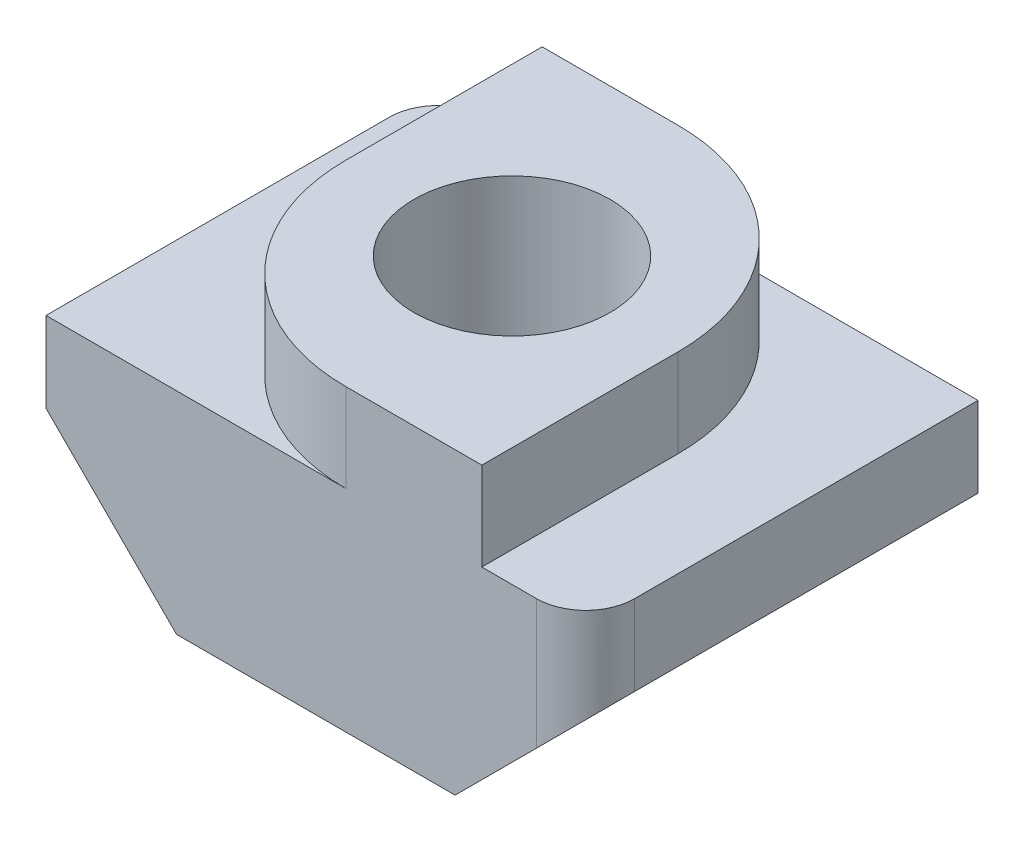
ISO-10303-21;
HEADER;
FILE_DESCRIPTION(('STEP AP214'),'2;1');
FILE_NAME('part.step','',(''),(''),'','','');
FILE_SCHEMA(('AUTOMOTIVE_DESIGN { 1 0 10303 214 1 1 1 1 }'));
ENDSEC;
DATA;
#1=APPLICATION_CONTEXT('core data for automotive mechanical design processes');
#2=APPLICATION_PROTOCOL_DEFINITION('international standard','automotive_design',2000,#1);
#3=PRODUCT_CONTEXT('',#1,'mechanical');
#4=PRODUCT('Part','Part','',(#3));
#5=PRODUCT_RELATED_PRODUCT_CATEGORY('part','',(#4));
#6=PRODUCT_DEFINITION_FORMATION('','',#4);
#7=PRODUCT_DEFINITION_CONTEXT('part definition',#1,'design');
#8=PRODUCT_DEFINITION('design','',#6,#7);
#9=PRODUCT_DEFINITION_SHAPE('','',#8);
#10=(LENGTH_UNIT() NAMED_UNIT(*) SI_UNIT(.MILLI.,.METRE.));
#11=(NAMED_UNIT(*) PLANE_ANGLE_UNIT() SI_UNIT($,.RADIAN.));
#12=(NAMED_UNIT(*) SI_UNIT($,.STERADIAN.) SOLID_ANGLE_UNIT());
#13=UNCERTAINTY_MEASURE_WITH_UNIT(LENGTH_MEASURE(1.E-05),#10,'distance_accuracy_value','');
#14=(GEOMETRIC_REPRESENTATION_CONTEXT(3) GLOBAL_UNCERTAINTY_ASSIGNED_CONTEXT((#13)) GLOBAL_UNIT_ASSIGNED_CONTEXT((#10,
#11,#12)) REPRESENTATION_CONTEXT('',''));
#15=CARTESIAN_POINT('',(0.,0.,0.));
#16=DIRECTION('',(0.,0.,1.));
#17=DIRECTION('',(1.,0.,0.));
#18=AXIS2_PLACEMENT_3D('',#15,#16,#17);
#19=CARTESIAN_POINT('',(0.,4.3,0.));
#20=DIRECTION('',(0.,-1.,0.));
#21=DIRECTION('',(0.,0.,-1.));
#22=AXIS2_PLACEMENT_3D('',#19,#20,#21);
#23=PLANE('',#22);
#24=DIRECTION('',(1.,0.,0.));
#25=VECTOR('',#24,1.);
#26=CARTESIAN_POINT('',(-5.5,4.3,4.));
#27=LINE('',#26,#25);
#28=CARTESIAN_POINT('',(3.385,4.3,4.));
#29=VERTEX_POINT('',#28);
#30=CARTESIAN_POINT('',(4.5,4.3,4.));
#31=VERTEX_POINT('',#30);
#32=EDGE_CURVE('E255',#29,#31,#27,.T.);
#33=ORIENTED_EDGE('',*,*,#32,.T.);
#34=CARTESIAN_POINT('',(4.5,4.3,3.));
#35=DIRECTION('',(0.,-1.,0.));
#36=DIRECTION('',(0.,0.,-1.));
#37=AXIS2_PLACEMENT_3D('',#34,#35,#36);
#38=CIRCLE('',#37,1.);
#39=CARTESIAN_POINT('',(5.5,4.3,3.));
#40=VERTEX_POINT('',#39);
#41=EDGE_CURVE('E203',#31,#40,#38,.F.);
#42=ORIENTED_EDGE('',*,*,#41,.T.);
#43=DIRECTION('',(0.,0.,-1.));
#44=VECTOR('',#43,1.);
#45=CARTESIAN_POINT('',(5.5,4.3,4.));
#46=LINE('',#45,#44);
#47=CARTESIAN_POINT('',(5.5,4.3,-4.));
#48=VERTEX_POINT('',#47);
#49=EDGE_CURVE('E233',#40,#48,#46,.T.);
#50=ORIENTED_EDGE('',*,*,#49,.T.);
#51=DIRECTION('',(-1.,0.,0.));
#52=VECTOR('',#51,1.);
#53=CARTESIAN_POINT('',(-5.5,4.3,-4.));
#54=LINE('',#53,#52);
#55=CARTESIAN_POINT('',(-0.615,4.3,-4.));
#56=VERTEX_POINT('',#55);
#57=EDGE_CURVE('E243',#48,#56,#54,.T.);
#58=ORIENTED_EDGE('',*,*,#57,.T.);
#59=CARTESIAN_POINT('',(-0.615,4.3,0.));
#60=DIRECTION('',(0.,-1.,0.));
#61=DIRECTION('',(0.,0.,-1.));
#62=AXIS2_PLACEMENT_3D('',#59,#60,#61);
#63=CIRCLE('',#62,4.);
#64=CARTESIAN_POINT('',(3.385,4.3,0.));
#65=VERTEX_POINT('',#64);
#66=EDGE_CURVE('E192',#56,#65,#63,.T.);
#67=ORIENTED_EDGE('',*,*,#66,.T.);
#68=DIRECTION('',(0.,0.,-1.));
#69=VECTOR('',#68,1.);
#70=CARTESIAN_POINT('',(3.385,4.3,4.));
#71=LINE('',#70,#69);
#72=EDGE_CURVE('E169',#29,#65,#71,.T.);
#73=ORIENTED_EDGE('',*,*,#72,.F.);
#74=EDGE_LOOP('',(#33,#42,#50,#58,#67,#73));
#75=FACE_BOUND('',#74,.T.);
#76=ADVANCED_FACE('F32',(#75),#23,.F.);
#77=CARTESIAN_POINT('',(-3.385,4.3,-4.));
#78=VERTEX_POINT('',#77);
#79=CARTESIAN_POINT('',(-4.5,4.3,-4.));
#80=VERTEX_POINT('',#79);
#81=EDGE_CURVE('E150',#78,#80,#54,.T.);
#82=ORIENTED_EDGE('',*,*,#81,.T.);
#83=CARTESIAN_POINT('',(-4.5,4.3,-3.));
#84=DIRECTION('',(0.,-1.,0.));
#85=DIRECTION('',(0.,0.,-1.));
#86=AXIS2_PLACEMENT_3D('',#83,#84,#85);
#87=CIRCLE('',#86,1.);
#88=CARTESIAN_POINT('',(-5.5,4.3,-3.));
#89=VERTEX_POINT('',#88);
#90=EDGE_CURVE('E11',#80,#89,#87,.F.);
#91=ORIENTED_EDGE('',*,*,#90,.T.);
#92=DIRECTION('',(0.,0.,1.));
#93=VECTOR('',#92,1.);
#94=CARTESIAN_POINT('',(-5.5,4.3,4.));
#95=LINE('',#94,#93);
#96=CARTESIAN_POINT('',(-5.5,4.3,4.));
#97=VERTEX_POINT('',#96);
#98=EDGE_CURVE('E215',#89,#97,#95,.T.);
#99=ORIENTED_EDGE('',*,*,#98,.T.);
#100=CARTESIAN_POINT('',(0.615,4.3,4.));
#101=VERTEX_POINT('',#100);
#102=EDGE_CURVE('E249',#97,#101,#27,.T.);
#103=ORIENTED_EDGE('',*,*,#102,.T.);
#104=CARTESIAN_POINT('',(0.615,4.3,0.));
#105=DIRECTION('',(0.,-1.,0.));
#106=DIRECTION('',(0.,0.,-1.));
#107=AXIS2_PLACEMENT_3D('',#104,#105,#106);
#108=CIRCLE('',#107,4.);
#109=CARTESIAN_POINT('',(-3.385,4.3,0.));
#110=VERTEX_POINT('',#109);
#111=EDGE_CURVE('E194',#101,#110,#108,.T.);
#112=ORIENTED_EDGE('',*,*,#111,.T.);
#113=DIRECTION('',(0.,0.,1.));
#114=VECTOR('',#113,1.);
#115=CARTESIAN_POINT('',(-3.385,4.3,4.));
#116=LINE('',#115,#114);
#117=EDGE_CURVE('E173',#78,#110,#116,.T.);
#118=ORIENTED_EDGE('',*,*,#117,.F.);
#119=EDGE_LOOP('',(#82,#91,#99,#103,#112,#118));
#120=FACE_BOUND('',#119,.T.);
#121=ADVANCED_FACE('F264',(#120),#23,.F.);
#122=CARTESIAN_POINT('',(0.,0.,0.));
#123=DIRECTION('',(0.,-1.,0.));
#124=DIRECTION('',(0.,0.,-1.));
#125=AXIS2_PLACEMENT_3D('',#122,#123,#124);
#126=PLANE('',#125);
#127=DIRECTION('',(0.,0.,1.));
#128=VECTOR('',#127,1.);
#129=CARTESIAN_POINT('',(2.84000000000001,0.,-4.));
#130=LINE('',#129,#128);
#131=CARTESIAN_POINT('',(2.84000000000001,0.,-4.));
#132=VERTEX_POINT('',#131);
#133=CARTESIAN_POINT('',(2.84000000000001,0.,4.));
#134=VERTEX_POINT('',#133);
#135=EDGE_CURVE('E341',#132,#134,#130,.T.);
#136=ORIENTED_EDGE('',*,*,#135,.T.);
#137=DIRECTION('',(1.,0.,0.));
#138=VECTOR('',#137,1.);
#139=CARTESIAN_POINT('',(-5.5,0.,4.));
#140=LINE('',#139,#138);
#141=CARTESIAN_POINT('',(-2.84000000000001,0.,4.));
#142=VERTEX_POINT('',#141);
#143=EDGE_CURVE('E235',#142,#134,#140,.T.);
#144=ORIENTED_EDGE('',*,*,#143,.F.);
#145=DIRECTION('',(0.,0.,1.));
#146=VECTOR('',#145,1.);
#147=CARTESIAN_POINT('',(-2.84000000000001,0.,-4.));
#148=LINE('',#147,#146);
#149=CARTESIAN_POINT('',(-2.84000000000001,0.,-4.));
#150=VERTEX_POINT('',#149);
#151=EDGE_CURVE('E223',#150,#142,#148,.T.);
#152=ORIENTED_EDGE('',*,*,#151,.F.);
#153=DIRECTION('',(-1.,0.,0.));
#154=VECTOR('',#153,1.);
#155=CARTESIAN_POINT('',(-5.5,0.,-4.));
#156=LINE('',#155,#154);
#157=EDGE_CURVE('E226',#132,#150,#156,.T.);
#158=ORIENTED_EDGE('',*,*,#157,.F.);
#159=EDGE_LOOP('',(#136,#144,#152,#158));
#160=FACE_BOUND('',#159,.T.);
#161=CARTESIAN_POINT('',(0.,0.,0.));
#162=DIRECTION('',(0.,1.,0.));
#163=DIRECTION('',(0.,0.,1.));
#164=AXIS2_PLACEMENT_3D('',#161,#162,#163);
#165=CIRCLE('',#164,2.);
#166=CARTESIAN_POINT('',(0.,0.,-2.));
#167=VERTEX_POINT('',#166);
#168=EDGE_CURVE('E222',#167,#167,#165,.T.);
#169=ORIENTED_EDGE('',*,*,#168,.T.);
#170=EDGE_LOOP('',(#169));
#171=FACE_BOUND('',#170,.T.);
#172=ADVANCED_FACE('F297',(#160,#171),#126,.T.);
#173=CARTESIAN_POINT('',(5.5,4.3,4.));
#174=DIRECTION('',(-1.,0.,0.));
#175=DIRECTION('',(0.,0.,1.));
#176=AXIS2_PLACEMENT_3D('',#173,#174,#175);
#177=PLANE('',#176);
#178=ORIENTED_EDGE('',*,*,#49,.F.);
#179=DIRECTION('',(0.,-1.,0.));
#180=VECTOR('',#179,1.);
#181=CARTESIAN_POINT('',(5.5,4.3,3.));
#182=LINE('',#181,#180);
#183=CARTESIAN_POINT('',(5.5,2.66,3.));
#184=VERTEX_POINT('',#183);
#185=EDGE_CURVE('E196',#40,#184,#182,.T.);
#186=ORIENTED_EDGE('',*,*,#185,.T.);
#187=DIRECTION('',(0.,0.,1.));
#188=VECTOR('',#187,1.);
#189=CARTESIAN_POINT('',(5.5,2.66,-4.));
#190=LINE('',#189,#188);
#191=CARTESIAN_POINT('',(5.5,2.66,-4.));
#192=VERTEX_POINT('',#191);
#193=EDGE_CURVE('E332',#192,#184,#190,.T.);
#194=ORIENTED_EDGE('',*,*,#193,.F.);
#195=DIRECTION('',(0.,-1.,0.));
#196=VECTOR('',#195,1.);
#197=CARTESIAN_POINT('',(5.5,4.3,-4.));
#198=LINE('',#197,#196);
#199=EDGE_CURVE('E183',#48,#192,#198,.T.);
#200=ORIENTED_EDGE('',*,*,#199,.F.);
#201=EDGE_LOOP('',(#178,#186,#194,#200));
#202=FACE_BOUND('',#201,.T.);
#203=ADVANCED_FACE('F303',(#202),#177,.F.);
#204=CARTESIAN_POINT('',(-5.5,4.3,-4.));
#205=DIRECTION('',(0.,0.,1.));
#206=DIRECTION('',(1.,0.,0.));
#207=AXIS2_PLACEMENT_3D('',#204,#205,#206);
#208=PLANE('',#207);
#209=DIRECTION('',(-0.707106781186546,0.707106781186549,0.));
#210=VECTOR('',#209,1.);
#211=CARTESIAN_POINT('',(-5.5,2.66,-4.));
#212=LINE('',#211,#210);
#213=CARTESIAN_POINT('',(-4.5,1.66,-4.));
#214=VERTEX_POINT('',#213);
#215=EDGE_CURVE('E228',#150,#214,#212,.T.);
#216=ORIENTED_EDGE('',*,*,#215,.T.);
#217=DIRECTION('',(0.,-1.,0.));
#218=VECTOR('',#217,1.);
#219=CARTESIAN_POINT('',(-4.5,4.3,-4.));
#220=LINE('',#219,#218);
#221=EDGE_CURVE('E40',#214,#80,#220,.F.);
#222=ORIENTED_EDGE('',*,*,#221,.T.);
#223=ORIENTED_EDGE('',*,*,#81,.F.);
#224=DIRECTION('',(0.,-1.,0.));
#225=VECTOR('',#224,1.);
#226=CARTESIAN_POINT('',(-3.385,6.1,-4.));
#227=LINE('',#226,#225);
#228=CARTESIAN_POINT('',(-3.385,6.1,-4.));
#229=VERTEX_POINT('',#228);
#230=EDGE_CURVE('E148',#229,#78,#227,.T.);
#231=ORIENTED_EDGE('',*,*,#230,.F.);
#232=DIRECTION('',(-1.,0.,0.));
#233=VECTOR('',#232,1.);
#234=CARTESIAN_POINT('',(-3.385,6.1,-4.));
#235=LINE('',#234,#233);
#236=CARTESIAN_POINT('',(-0.615,6.1,-4.));
#237=VERTEX_POINT('',#236);
#238=EDGE_CURVE('E133',#237,#229,#235,.T.);
#239=ORIENTED_EDGE('',*,*,#238,.F.);
#240=DIRECTION('',(0.,-1.,0.));
#241=VECTOR('',#240,1.);
#242=CARTESIAN_POINT('',(-0.615,4.3,-4.));
#243=LINE('',#242,#241);
#244=EDGE_CURVE('E180',#237,#56,#243,.T.);
#245=ORIENTED_EDGE('',*,*,#244,.T.);
#246=ORIENTED_EDGE('',*,*,#57,.F.);
#247=ORIENTED_EDGE('',*,*,#199,.T.);
#248=DIRECTION('',(-0.707106781186547,-0.707106781186548,0.));
#249=VECTOR('',#248,1.);
#250=CARTESIAN_POINT('',(5.5,2.66,-4.));
#251=LINE('',#250,#249);
#252=EDGE_CURVE('E334',#192,#132,#251,.T.);
#253=ORIENTED_EDGE('',*,*,#252,.T.);
#254=ORIENTED_EDGE('',*,*,#157,.T.);
#255=EDGE_LOOP('',(#216,#222,#223,#231,#239,#245,#246,#247,#253,#254));
#256=FACE_BOUND('',#255,.T.);
#257=ADVANCED_FACE('F149',(#256),#208,.F.);
#258=CARTESIAN_POINT('',(-5.5,4.3,4.));
#259=DIRECTION('',(1.,0.,0.));
#260=DIRECTION('',(0.,0.,-1.));
#261=AXIS2_PLACEMENT_3D('',#258,#259,#260);
#262=PLANE('',#261);
#263=ORIENTED_EDGE('',*,*,#98,.F.);
#264=DIRECTION('',(0.,-1.,0.));
#265=VECTOR('',#264,1.);
#266=CARTESIAN_POINT('',(-5.5,4.3,-3.));
#267=LINE('',#266,#265);
#268=CARTESIAN_POINT('',(-5.5,2.66,-3.));
#269=VERTEX_POINT('',#268);
#270=EDGE_CURVE('E205',#89,#269,#267,.T.);
#271=ORIENTED_EDGE('',*,*,#270,.T.);
#272=DIRECTION('',(0.,0.,1.));
#273=VECTOR('',#272,1.);
#274=CARTESIAN_POINT('',(-5.5,2.66,-4.));
#275=LINE('',#274,#273);
#276=CARTESIAN_POINT('',(-5.5,2.66,4.));
#277=VERTEX_POINT('',#276);
#278=EDGE_CURVE('E213',#269,#277,#275,.T.);
#279=ORIENTED_EDGE('',*,*,#278,.T.);
#280=DIRECTION('',(0.,-1.,0.));
#281=VECTOR('',#280,1.);
#282=CARTESIAN_POINT('',(-5.5,4.3,4.));
#283=LINE('',#282,#281);
#284=EDGE_CURVE('E247',#97,#277,#283,.T.);
#285=ORIENTED_EDGE('',*,*,#284,.F.);
#286=EDGE_LOOP('',(#263,#271,#279,#285));
#287=FACE_BOUND('',#286,.T.);
#288=ADVANCED_FACE('F211',(#287),#262,.F.);
#289=CARTESIAN_POINT('',(-5.5,4.3,4.));
#290=DIRECTION('',(0.,0.,-1.));
#291=DIRECTION('',(-1.,0.,0.));
#292=AXIS2_PLACEMENT_3D('',#289,#290,#291);
#293=PLANE('',#292);
#294=DIRECTION('',(-0.707106781186547,-0.707106781186548,0.));
#295=VECTOR('',#294,1.);
#296=CARTESIAN_POINT('',(5.5,2.66,4.));
#297=LINE('',#296,#295);
#298=CARTESIAN_POINT('',(4.5,1.66,4.));
#299=VERTEX_POINT('',#298);
#300=EDGE_CURVE('E153',#299,#134,#297,.T.);
#301=ORIENTED_EDGE('',*,*,#300,.F.);
#302=DIRECTION('',(0.,-1.,0.));
#303=VECTOR('',#302,1.);
#304=CARTESIAN_POINT('',(4.5,4.3,4.));
#305=LINE('',#304,#303);
#306=EDGE_CURVE('E201',#299,#31,#305,.F.);
#307=ORIENTED_EDGE('',*,*,#306,.T.);
#308=ORIENTED_EDGE('',*,*,#32,.F.);
#309=DIRECTION('',(0.,-1.,0.));
#310=VECTOR('',#309,1.);
#311=CARTESIAN_POINT('',(3.385,6.1,4.));
#312=LINE('',#311,#310);
#313=CARTESIAN_POINT('',(3.385,6.1,4.));
#314=VERTEX_POINT('',#313);
#315=EDGE_CURVE('E154',#314,#29,#312,.T.);
#316=ORIENTED_EDGE('',*,*,#315,.F.);
#317=DIRECTION('',(1.,0.,0.));
#318=VECTOR('',#317,1.);
#319=CARTESIAN_POINT('',(-3.385,6.1,4.));
#320=LINE('',#319,#318);
#321=CARTESIAN_POINT('',(0.615,6.1,4.));
#322=VERTEX_POINT('',#321);
#323=EDGE_CURVE('E159',#322,#314,#320,.T.);
#324=ORIENTED_EDGE('',*,*,#323,.F.);
#325=DIRECTION('',(0.,-1.,0.));
#326=VECTOR('',#325,1.);
#327=CARTESIAN_POINT('',(0.615,4.3,4.));
#328=LINE('',#327,#326);
#329=EDGE_CURVE('E188',#322,#101,#328,.T.);
#330=ORIENTED_EDGE('',*,*,#329,.T.);
#331=ORIENTED_EDGE('',*,*,#102,.F.);
#332=ORIENTED_EDGE('',*,*,#284,.T.);
#333=DIRECTION('',(-0.707106781186546,0.707106781186549,0.));
#334=VECTOR('',#333,1.);
#335=CARTESIAN_POINT('',(-5.5,2.66,4.));
#336=LINE('',#335,#334);
#337=EDGE_CURVE('E220',#142,#277,#336,.T.);
#338=ORIENTED_EDGE('',*,*,#337,.F.);
#339=ORIENTED_EDGE('',*,*,#143,.T.);
#340=EDGE_LOOP('',(#301,#307,#308,#316,#324,#330,#331,#332,#338,#339));
#341=FACE_BOUND('',#340,.T.);
#342=ADVANCED_FACE('F267',(#341),#293,.F.);
#343=CARTESIAN_POINT('',(0.,4.3,0.));
#344=DIRECTION('',(0.,-1.,0.));
#345=DIRECTION('',(0.,0.,-1.));
#346=AXIS2_PLACEMENT_3D('',#343,#344,#345);
#347=CYLINDRICAL_SURFACE('',#346,2.);
#348=CARTESIAN_POINT('',(0.,6.1,0.));
#349=DIRECTION('',(0.,1.,0.));
#350=DIRECTION('',(0.,0.,1.));
#351=AXIS2_PLACEMENT_3D('',#348,#349,#350);
#352=CIRCLE('',#351,2.);
#353=CARTESIAN_POINT('',(0.,6.1,-2.));
#354=VERTEX_POINT('',#353);
#355=EDGE_CURVE('E174',#354,#354,#352,.T.);
#356=CARTESIAN_POINT('',(0.,0.,-2.));
#357=CARTESIAN_POINT('',(0.,0.0635416666666657,-2.));
#358=CARTESIAN_POINT('',(0.,0.127083333333332,-2.));
#359=CARTESIAN_POINT('',(0.,0.254166666666666,-2.));
#360=CARTESIAN_POINT('',(0.,0.317708333333332,-2.));
#361=CARTESIAN_POINT('',(0.,0.444791666666665,-2.));
#362=CARTESIAN_POINT('',(0.,0.508333333333332,-2.));
#363=CARTESIAN_POINT('',(0.,0.635416666666666,-2.));
#364=CARTESIAN_POINT('',(0.,0.698958333333332,-2.));
#365=CARTESIAN_POINT('',(0.,0.826041666666665,-2.));
#366=CARTESIAN_POINT('',(0.,0.889583333333332,-2.));
#367=CARTESIAN_POINT('',(0.,1.01666666666667,-2.));
#368=CARTESIAN_POINT('',(0.,1.08020833333333,-2.));
#369=CARTESIAN_POINT('',(0.,1.20729166666667,-2.));
#370=CARTESIAN_POINT('',(0.,1.27083333333333,-2.));
#371=CARTESIAN_POINT('',(0.,1.39791666666667,-2.));
#372=CARTESIAN_POINT('',(0.,1.46145833333333,-2.));
#373=CARTESIAN_POINT('',(0.,1.58854166666667,-2.));
#374=CARTESIAN_POINT('',(0.,1.65208333333333,-2.));
#375=CARTESIAN_POINT('',(0.,1.77916666666667,-2.));
#376=CARTESIAN_POINT('',(0.,1.84270833333333,-2.));
#377=CARTESIAN_POINT('',(0.,1.96979166666667,-2.));
#378=CARTESIAN_POINT('',(0.,2.03333333333333,-2.));
#379=CARTESIAN_POINT('',(0.,2.16041666666667,-2.));
#380=CARTESIAN_POINT('',(0.,2.22395833333333,-2.));
#381=CARTESIAN_POINT('',(0.,2.35104166666667,-2.));
#382=CARTESIAN_POINT('',(0.,2.41458333333333,-2.));
#383=CARTESIAN_POINT('',(0.,2.54166666666667,-2.));
#384=CARTESIAN_POINT('',(0.,2.60520833333333,-2.));
#385=CARTESIAN_POINT('',(0.,2.73229166666667,-2.));
#386=CARTESIAN_POINT('',(0.,2.79583333333333,-2.));
#387=CARTESIAN_POINT('',(0.,2.92291666666667,-2.));
#388=CARTESIAN_POINT('',(0.,2.98645833333333,-2.));
#389=CARTESIAN_POINT('',(0.,3.11354166666667,-2.));
#390=CARTESIAN_POINT('',(0.,3.17708333333333,-2.));
#391=CARTESIAN_POINT('',(0.,3.30416666666667,-2.));
#392=CARTESIAN_POINT('',(0.,3.36770833333333,-2.));
#393=CARTESIAN_POINT('',(0.,3.49479166666667,-2.));
#394=CARTESIAN_POINT('',(0.,3.55833333333333,-2.));
#395=CARTESIAN_POINT('',(0.,3.68541666666667,-2.));
#396=CARTESIAN_POINT('',(0.,3.74895833333333,-2.));
#397=CARTESIAN_POINT('',(0.,3.87604166666667,-2.));
#398=CARTESIAN_POINT('',(0.,3.93958333333333,-2.));
#399=CARTESIAN_POINT('',(0.,4.06666666666667,-2.));
#400=CARTESIAN_POINT('',(0.,4.13020833333333,-2.));
#401=CARTESIAN_POINT('',(0.,4.25729166666667,-2.));
#402=CARTESIAN_POINT('',(0.,4.32083333333333,-2.));
#403=CARTESIAN_POINT('',(0.,4.44791666666667,-2.));
#404=CARTESIAN_POINT('',(0.,4.51145833333333,-2.));
#405=CARTESIAN_POINT('',(0.,4.63854166666667,-2.));
#406=CARTESIAN_POINT('',(0.,4.70208333333333,-2.));
#407=CARTESIAN_POINT('',(0.,4.82916666666667,-2.));
#408=CARTESIAN_POINT('',(0.,4.89270833333333,-2.));
#409=CARTESIAN_POINT('',(0.,5.01979166666667,-2.));
#410=CARTESIAN_POINT('',(0.,5.08333333333333,-2.));
#411=CARTESIAN_POINT('',(0.,5.21041666666667,-2.));
#412=CARTESIAN_POINT('',(0.,5.27395833333333,-2.));
#413=CARTESIAN_POINT('',(0.,5.40104166666667,-2.));
#414=CARTESIAN_POINT('',(0.,5.46458333333333,-2.));
#415=CARTESIAN_POINT('',(0.,5.59166666666667,-2.));
#416=CARTESIAN_POINT('',(0.,5.65520833333333,-2.));
#417=CARTESIAN_POINT('',(0.,5.78229166666667,-2.));
#418=CARTESIAN_POINT('',(0.,5.84583333333333,-2.));
#419=CARTESIAN_POINT('',(0.,5.97291666666667,-2.));
#420=CARTESIAN_POINT('',(0.,6.03645833333333,-2.));
#421=CARTESIAN_POINT('',(0.,6.1,-2.));
#422=B_SPLINE_CURVE_WITH_KNOTS('',3,(#356,#357,#358,#359,#360,#361,#362,#363,#364,#365,#366,
#367,#368,#369,#370,#371,#372,#373,#374,#375,#376,#377,#378,#379,#380,#381,#382,#383,#384,#385,
#386,#387,#388,#389,#390,#391,#392,#393,#394,#395,#396,#397,#398,#399,#400,#401,#402,#403,#404,
#405,#406,#407,#408,#409,#410,#411,#412,#413,#414,#415,#416,#417,#418,#419,#420,#421),
.UNSPECIFIED.,.F.,.F.,(4,2,2,2,2,2,2,2,2,2,2,2,2,2,2,2,2,2,2,2,2,2,2,2,2,2,2,2,2,2,2,2,4),(0.,
0.190625,0.38125,0.571875,0.7625,0.953125,1.14375,1.334375,1.525,1.715625,1.90625,2.096875,
2.2875,2.478125,2.66875,2.859375,3.05,3.240625,3.43125,3.621875,3.8125,4.003125,4.19375,
4.384375,4.575,4.765625,4.95625,5.146875,5.3375,5.528125,5.71875,5.909375,6.1),.UNSPECIFIED.);
#423=EDGE_CURVE('BSEAM278',#167,#354,#422,.T.);
#424=ORIENTED_EDGE('',*,*,#168,.F.);
#425=ORIENTED_EDGE('',*,*,#355,.T.);
#426=ORIENTED_EDGE('',*,*,#423,.T.);
#427=ORIENTED_EDGE('',*,*,#423,.F.);
#428=EDGE_LOOP('',(#424,#426,#425,#427));
#429=FACE_BOUND('',#428,.T.);
#430=ADVANCED_FACE('F278',(#429),#347,.F.);
#431=CARTESIAN_POINT('',(-5.5,2.66,-4.));
#432=DIRECTION('',(0.707106781186549,0.707106781186546,0.));
#433=DIRECTION('',(-0.707106781186546,0.707106781186549,0.));
#434=AXIS2_PLACEMENT_3D('',#431,#432,#433);
#435=PLANE('',#434);
#436=ORIENTED_EDGE('',*,*,#278,.F.);
#437=CARTESIAN_POINT('',(-4.5,1.66,-3.));
#438=DIRECTION('',(0.707106781186549,0.707106781186546,0.));
#439=DIRECTION('',(0.707106781186546,-0.707106781186549,0.));
#440=AXIS2_PLACEMENT_3D('',#437,#438,#439);
#441=ELLIPSE('',#440,1.4142135623731,1.);
#442=EDGE_CURVE('E54',#269,#214,#441,.F.);
#443=ORIENTED_EDGE('',*,*,#442,.T.);
#444=ORIENTED_EDGE('',*,*,#215,.F.);
#445=ORIENTED_EDGE('',*,*,#151,.T.);
#446=ORIENTED_EDGE('',*,*,#337,.T.);
#447=EDGE_LOOP('',(#436,#443,#444,#445,#446));
#448=FACE_BOUND('',#447,.T.);
#449=ADVANCED_FACE('F218',(#448),#435,.F.);
#450=CARTESIAN_POINT('',(5.5,2.66,-4.));
#451=DIRECTION('',(-0.707106781186549,0.707106781186547,0.));
#452=DIRECTION('',(-0.707106781186547,-0.707106781186549,0.));
#453=AXIS2_PLACEMENT_3D('',#450,#451,#452);
#454=PLANE('',#453);
#455=ORIENTED_EDGE('',*,*,#193,.T.);
#456=CARTESIAN_POINT('',(4.5,1.66,3.));
#457=DIRECTION('',(-0.707106781186549,0.707106781186547,0.));
#458=DIRECTION('',(-0.707106781186547,-0.707106781186549,0.));
#459=AXIS2_PLACEMENT_3D('',#456,#457,#458);
#460=ELLIPSE('',#459,1.4142135623731,1.);
#461=EDGE_CURVE('E199',#184,#299,#460,.F.);
#462=ORIENTED_EDGE('',*,*,#461,.T.);
#463=ORIENTED_EDGE('',*,*,#300,.T.);
#464=ORIENTED_EDGE('',*,*,#135,.F.);
#465=ORIENTED_EDGE('',*,*,#252,.F.);
#466=EDGE_LOOP('',(#455,#462,#463,#464,#465));
#467=FACE_BOUND('',#466,.T.);
#468=ADVANCED_FACE('F281',(#467),#454,.F.);
#469=CARTESIAN_POINT('',(0.,6.1,0.));
#470=DIRECTION('',(0.,-1.,0.));
#471=DIRECTION('',(0.,0.,-1.));
#472=AXIS2_PLACEMENT_3D('',#469,#470,#471);
#473=PLANE('',#472);
#474=DIRECTION('',(0.,0.,-1.));
#475=VECTOR('',#474,1.);
#476=CARTESIAN_POINT('',(3.385,6.1,4.));
#477=LINE('',#476,#475);
#478=CARTESIAN_POINT('',(3.385,6.1,0.));
#479=VERTEX_POINT('',#478);
#480=EDGE_CURVE('E145',#314,#479,#477,.T.);
#481=ORIENTED_EDGE('',*,*,#480,.T.);
#482=CARTESIAN_POINT('',(-0.615,6.1,0.));
#483=DIRECTION('',(0.,-1.,0.));
#484=DIRECTION('',(0.,0.,-1.));
#485=AXIS2_PLACEMENT_3D('',#482,#483,#484);
#486=CIRCLE('',#485,4.);
#487=EDGE_CURVE('E142',#479,#237,#486,.F.);
#488=ORIENTED_EDGE('',*,*,#487,.T.);
#489=ORIENTED_EDGE('',*,*,#238,.T.);
#490=DIRECTION('',(0.,0.,1.));
#491=VECTOR('',#490,1.);
#492=CARTESIAN_POINT('',(-3.385,6.1,4.));
#493=LINE('',#492,#491);
#494=CARTESIAN_POINT('',(-3.385,6.1,0.));
#495=VERTEX_POINT('',#494);
#496=EDGE_CURVE('E139',#229,#495,#493,.T.);
#497=ORIENTED_EDGE('',*,*,#496,.T.);
#498=CARTESIAN_POINT('',(0.615,6.1,0.));
#499=DIRECTION('',(0.,-1.,0.));
#500=DIRECTION('',(0.,0.,-1.));
#501=AXIS2_PLACEMENT_3D('',#498,#499,#500);
#502=CIRCLE('',#501,4.);
#503=EDGE_CURVE('E185',#495,#322,#502,.F.);
#504=ORIENTED_EDGE('',*,*,#503,.T.);
#505=ORIENTED_EDGE('',*,*,#323,.T.);
#506=EDGE_LOOP('',(#481,#488,#489,#497,#504,#505));
#507=FACE_BOUND('',#506,.T.);
#508=ORIENTED_EDGE('',*,*,#355,.F.);
#509=EDGE_LOOP('',(#508));
#510=FACE_BOUND('',#509,.T.);
#511=ADVANCED_FACE('F136',(#507,#510),#473,.F.);
#512=CARTESIAN_POINT('',(3.385,6.1,4.));
#513=DIRECTION('',(-1.,0.,0.));
#514=DIRECTION('',(0.,0.,1.));
#515=AXIS2_PLACEMENT_3D('',#512,#513,#514);
#516=PLANE('',#515);
#517=ORIENTED_EDGE('',*,*,#72,.T.);
#518=DIRECTION('',(0.,-1.,0.));
#519=VECTOR('',#518,1.);
#520=CARTESIAN_POINT('',(3.385,6.1,0.));
#521=LINE('',#520,#519);
#522=EDGE_CURVE('E182',#65,#479,#521,.F.);
#523=ORIENTED_EDGE('',*,*,#522,.T.);
#524=ORIENTED_EDGE('',*,*,#480,.F.);
#525=ORIENTED_EDGE('',*,*,#315,.T.);
#526=EDGE_LOOP('',(#517,#523,#524,#525));
#527=FACE_BOUND('',#526,.T.);
#528=ADVANCED_FACE('F280',(#527),#516,.F.);
#529=CARTESIAN_POINT('',(-3.385,6.1,4.));
#530=DIRECTION('',(1.,0.,0.));
#531=DIRECTION('',(0.,0.,-1.));
#532=AXIS2_PLACEMENT_3D('',#529,#530,#531);
#533=PLANE('',#532);
#534=ORIENTED_EDGE('',*,*,#117,.T.);
#535=DIRECTION('',(0.,-1.,0.));
#536=VECTOR('',#535,1.);
#537=CARTESIAN_POINT('',(-3.385,6.1,0.));
#538=LINE('',#537,#536);
#539=EDGE_CURVE('E158',#110,#495,#538,.F.);
#540=ORIENTED_EDGE('',*,*,#539,.T.);
#541=ORIENTED_EDGE('',*,*,#496,.F.);
#542=ORIENTED_EDGE('',*,*,#230,.T.);
#543=EDGE_LOOP('',(#534,#540,#541,#542));
#544=FACE_BOUND('',#543,.T.);
#545=ADVANCED_FACE('F156',(#544),#533,.F.);
#546=CARTESIAN_POINT('',(-0.615,4.3,0.));
#547=DIRECTION('',(0.,-1.,0.));
#548=DIRECTION('',(0.,0.,-1.));
#549=AXIS2_PLACEMENT_3D('',#546,#547,#548);
#550=CYLINDRICAL_SURFACE('',#549,4.);
#551=ORIENTED_EDGE('',*,*,#487,.F.);
#552=ORIENTED_EDGE('',*,*,#522,.F.);
#553=ORIENTED_EDGE('',*,*,#66,.F.);
#554=ORIENTED_EDGE('',*,*,#244,.F.);
#555=EDGE_LOOP('',(#551,#552,#553,#554));
#556=FACE_BOUND('',#555,.T.);
#557=ADVANCED_FACE('F314',(#556),#550,.T.);
#558=CARTESIAN_POINT('',(0.615,4.3,0.));
#559=DIRECTION('',(0.,-1.,0.));
#560=DIRECTION('',(0.,0.,-1.));
#561=AXIS2_PLACEMENT_3D('',#558,#559,#560);
#562=CYLINDRICAL_SURFACE('',#561,4.);
#563=ORIENTED_EDGE('',*,*,#503,.F.);
#564=ORIENTED_EDGE('',*,*,#539,.F.);
#565=ORIENTED_EDGE('',*,*,#111,.F.);
#566=ORIENTED_EDGE('',*,*,#329,.F.);
#567=EDGE_LOOP('',(#563,#564,#565,#566));
#568=FACE_BOUND('',#567,.T.);
#569=ADVANCED_FACE('F272',(#568),#562,.T.);
#570=CARTESIAN_POINT('',(4.5,4.3,3.));
#571=DIRECTION('',(0.,-1.,0.));
#572=DIRECTION('',(0.,0.,-1.));
#573=AXIS2_PLACEMENT_3D('',#570,#571,#572);
#574=CYLINDRICAL_SURFACE('',#573,1.);
#575=ORIENTED_EDGE('',*,*,#41,.F.);
#576=ORIENTED_EDGE('',*,*,#306,.F.);
#577=ORIENTED_EDGE('',*,*,#461,.F.);
#578=ORIENTED_EDGE('',*,*,#185,.F.);
#579=EDGE_LOOP('',(#575,#576,#577,#578));
#580=FACE_BOUND('',#579,.T.);
#581=ADVANCED_FACE('F319',(#580),#574,.T.);
#582=CARTESIAN_POINT('',(-4.5,4.3,-3.));
#583=DIRECTION('',(0.,-1.,0.));
#584=DIRECTION('',(0.,0.,-1.));
#585=AXIS2_PLACEMENT_3D('',#582,#583,#584);
#586=CYLINDRICAL_SURFACE('',#585,1.);
#587=ORIENTED_EDGE('',*,*,#90,.F.);
#588=ORIENTED_EDGE('',*,*,#221,.F.);
#589=ORIENTED_EDGE('',*,*,#442,.F.);
#590=ORIENTED_EDGE('',*,*,#270,.F.);
#591=EDGE_LOOP('',(#587,#588,#589,#590));
#592=FACE_BOUND('',#591,.T.);
#593=ADVANCED_FACE('F34',(#592),#586,.T.);
#594=CLOSED_SHELL('',(#76,#121,#172,#203,#257,#288,#342,#430,#449,#468,#511,#528,#545,#557,#569,
#581,#593));
#595=MANIFOLD_SOLID_BREP('B2',#594);
#596=ADVANCED_BREP_SHAPE_REPRESENTATION('',(#18,#595),#14);
#597=SHAPE_DEFINITION_REPRESENTATION(#9,#596);
ENDSEC;
END-ISO-10303-21;
